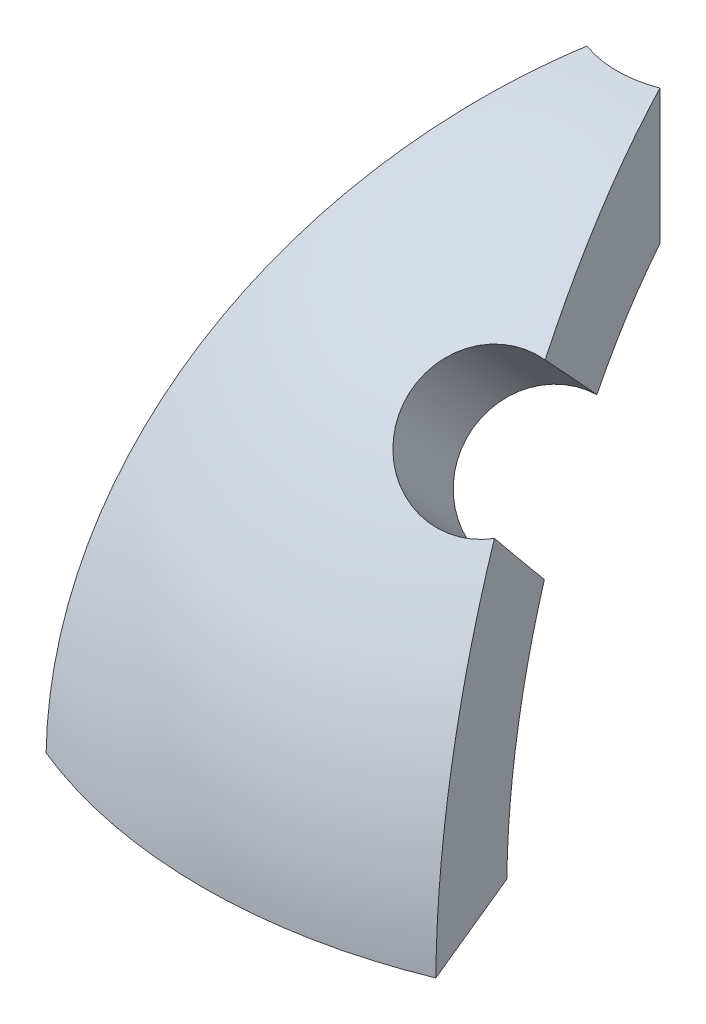
ISO-10303-21;
HEADER;
FILE_DESCRIPTION(('STEP AP214'),'2;1');
FILE_NAME('part.step','',(''),(''),'','','');
FILE_SCHEMA(('AUTOMOTIVE_DESIGN { 1 0 10303 214 1 1 1 1 }'));
ENDSEC;
DATA;
#1=APPLICATION_CONTEXT('core data for automotive mechanical design processes');
#2=APPLICATION_PROTOCOL_DEFINITION('international standard','automotive_design',2000,#1);
#3=PRODUCT_CONTEXT('',#1,'mechanical');
#4=PRODUCT('Part','Part','',(#3));
#5=PRODUCT_RELATED_PRODUCT_CATEGORY('part','',(#4));
#6=PRODUCT_DEFINITION_FORMATION('','',#4);
#7=PRODUCT_DEFINITION_CONTEXT('part definition',#1,'design');
#8=PRODUCT_DEFINITION('design','',#6,#7);
#9=PRODUCT_DEFINITION_SHAPE('','',#8);
#10=(LENGTH_UNIT() NAMED_UNIT(*) SI_UNIT(.MILLI.,.METRE.));
#11=(NAMED_UNIT(*) PLANE_ANGLE_UNIT() SI_UNIT($,.RADIAN.));
#12=(NAMED_UNIT(*) SI_UNIT($,.STERADIAN.) SOLID_ANGLE_UNIT());
#13=UNCERTAINTY_MEASURE_WITH_UNIT(LENGTH_MEASURE(1.E-05),#10,'distance_accuracy_value','');
#14=(GEOMETRIC_REPRESENTATION_CONTEXT(3) GLOBAL_UNCERTAINTY_ASSIGNED_CONTEXT((#13)) GLOBAL_UNIT_ASSIGNED_CONTEXT((#10,
#11,#12)) REPRESENTATION_CONTEXT('',''));
#15=CARTESIAN_POINT('',(0.,0.,0.));
#16=DIRECTION('',(0.,0.,1.));
#17=DIRECTION('',(1.,0.,0.));
#18=AXIS2_PLACEMENT_3D('',#15,#16,#17);
#19=CARTESIAN_POINT('',(7.17384970083417,0.249999999999994,17.6458459833991));
#20=DIRECTION('',(0.923879532511287,0.,-0.382683432365091));
#21=DIRECTION('',(-0.38268343236509,0.,-0.923879532511286));
#22=AXIS2_PLACEMENT_3D('',#19,#20,#21);
#23=PLANE('',#22);
#24=CARTESIAN_POINT('',(0.492321813532581,1.59318685539747,1.51521074050156));
#25=DIRECTION('',(0.923879532511287,0.,-0.382683432365091));
#26=DIRECTION('',(-0.270180002552571,-0.708197506935701,-0.652272226444412));
#27=AXIS2_PLACEMENT_3D('',#24,#25,#26);
#28=ELLIPSE('',#27,46.9277013134247,2.6035);
#29=CARTESIAN_POINT('',(2.98234832718969,11.6903075043123,7.52666652044114));
#30=VERTEX_POINT('',#29);
#31=CARTESIAN_POINT('',(4.32941926490117,15.0988892378005,10.7787834477428));
#32=VERTEX_POINT('',#31);
#33=EDGE_CURVE('E11',#30,#32,#28,.T.);
#34=ORIENTED_EDGE('',*,*,#33,.F.);
#35=CARTESIAN_POINT('',(-0.115484941563909,0.,0.0478354290456357));
#36=DIRECTION('',(0.923879532511287,0.,-0.382683432365091));
#37=DIRECTION('',(-0.38268343236509,0.,-0.923879532511286));
#38=AXIS2_PLACEMENT_3D('',#35,#36,#37);
#39=CIRCLE('',#38,14.2194505871359);
#40=CARTESIAN_POINT('',(1.34175402255179,13.7000839413487,3.56592149983228));
#41=VERTEX_POINT('',#40);
#42=EDGE_CURVE('E133',#30,#41,#39,.F.);
#43=ORIENTED_EDGE('',*,*,#42,.T.);
#44=DIRECTION('',(0.,-1.,0.));
#45=VECTOR('',#44,1.);
#46=CARTESIAN_POINT('',(1.34175402255179,0.249999999999994,3.56592149983228));
#47=LINE('',#46,#45);
#48=CARTESIAN_POINT('',(1.34175402255179,18.6651118400078,3.56592149983228));
#49=VERTEX_POINT('',#48);
#50=EDGE_CURVE('E306',#49,#41,#47,.T.);
#51=ORIENTED_EDGE('',*,*,#50,.F.);
#52=CARTESIAN_POINT('',(-0.115484941563909,0.,0.0478354290456357));
#53=DIRECTION('',(0.923879532511287,0.,-0.382683432365091));
#54=DIRECTION('',(-0.38268343236509,0.,-0.923879532511286));
#55=AXIS2_PLACEMENT_3D('',#52,#53,#54);
#56=CIRCLE('',#55,19.0495898905987);
#57=EDGE_CURVE('E142',#49,#32,#56,.T.);
#58=ORIENTED_EDGE('',*,*,#57,.T.);
#59=EDGE_LOOP('',(#34,#43,#51,#58));
#60=FACE_BOUND('',#59,.T.);
#61=ADVANCED_FACE('F32',(#60),#23,.T.);
#62=CARTESIAN_POINT('',(0.,0.,0.));
#63=DIRECTION('',(0.,-1.,0.));
#64=DIRECTION('',(0.382683432365091,0.,0.923879532511287));
#65=AXIS2_PLACEMENT_3D('',#62,#63,#64);
#66=SPHERICAL_SURFACE('',#65,14.22);
#67=CARTESIAN_POINT('',(-1.48166666666665,5.87529327607244,12.8644468520425));
#68=CARTESIAN_POINT('',(-1.42086893273893,5.76975036627852,12.9196521368901));
#69=CARTESIAN_POINT('',(-1.36001346299936,5.66335616706572,12.9731664611157));
#70=CARTESIAN_POINT('',(-1.23637473856811,5.44571138508336,13.0783402627304));
#71=CARTESIAN_POINT('',(-1.17358894317086,5.33441133368615,13.129894406193));
#72=CARTESIAN_POINT('',(-1.04611725994298,5.10690837230407,13.2307839552985));
#73=CARTESIAN_POINT('',(-0.981429827464168,4.99065756610066,13.2800094265762));
#74=CARTESIAN_POINT('',(-0.850206043293077,4.75321700490823,13.3758648751859));
#75=CARTESIAN_POINT('',(-0.783669691408958,4.63198105417047,13.4223804529465));
#76=CARTESIAN_POINT('',(-0.648818878876879,4.38454861638548,13.5124257578623));
#77=CARTESIAN_POINT('',(-0.580506340326631,4.25830785909068,13.5558367279241));
#78=CARTESIAN_POINT('',(-0.44220033088774,4.00085602750009,13.6392712749654));
#79=CARTESIAN_POINT('',(-0.372211218313539,3.86960273238015,13.6791719067114));
#80=CARTESIAN_POINT('',(-0.239264709370852,3.61840253676486,13.7505509697998));
#81=CARTESIAN_POINT('',(-0.176283542174099,3.49859339830511,13.7824709063809));
#82=CARTESIAN_POINT('',(-0.0483877174452765,3.25370801386755,13.8434149901452));
#83=CARTESIAN_POINT('',(0.0165184869663606,3.12859289852388,13.8723008279838));
#84=CARTESIAN_POINT('',(0.148172985815007,2.87309896609117,13.9267314310082));
#85=CARTESIAN_POINT('',(0.21491041802518,2.74268389154307,13.9521324200803));
#86=CARTESIAN_POINT('',(0.343164735365423,2.49027877052822,13.9967203057924));
#87=CARTESIAN_POINT('',(0.404711039503561,2.36835935764257,14.0162232249644));
#88=CARTESIAN_POINT('',(0.530033371249447,2.1185076517405,14.0520491156242));
#89=CARTESIAN_POINT('',(0.593791791052467,1.99054177695114,14.0681997859072));
#90=CARTESIAN_POINT('',(0.723418550548894,1.7286220788303,14.0967857912238));
#91=CARTESIAN_POINT('',(0.78926595677875,1.59463823943027,14.1090412249634));
#92=CARTESIAN_POINT('',(0.854807692307689,1.46033282107786,14.1189635547676));
#93=B_SPLINE_CURVE_WITH_KNOTS('',3,(#67,#68,#69,#70,#71,#72,#73,#74,#75,#76,#77,#78,#79,#80,#81,
#82,#83,#84,#85,#86,#87,#88,#89,#90,#91,#92),.UNSPECIFIED.,.F.,.F.,(4,2,2,2,2,2,2,2,2,2,2,2,4),
(0.,0.401172200971263,0.814500006306101,1.23999083596385,1.67764315177395,2.12744659449352,
2.58938209434428,3.00652551609497,3.43809407127766,3.88407377372127,4.29789288094576,
4.72946381163026,5.17876538736432),.UNSPECIFIED.);
#94=CARTESIAN_POINT('',(-1.48166666666665,5.87529327607244,12.8644468520425));
#95=VERTEX_POINT('',#94);
#96=CARTESIAN_POINT('',(0.85480769230769,1.46033282107786,14.1189635547676));
#97=VERTEX_POINT('',#96);
#98=EDGE_CURVE('E270',#95,#97,#93,.T.);
#99=ORIENTED_EDGE('',*,*,#98,.T.);
#100=CARTESIAN_POINT('',(1.9112146306949,-3.20816110225398,1.32886383883141));
#101=DIRECTION('',(-0.482179429384514,0.809385437310081,-0.335258425321114));
#102=DIRECTION('',(-0.859105109331939,-0.51179919022968,0.));
#103=AXIS2_PLACEMENT_3D('',#100,#101,#102);
#104=CIRCLE('',#103,13.6564080883389);
#105=CARTESIAN_POINT('',(1.19940204326923,1.64671129814356,14.0733143445021));
#106=VERTEX_POINT('',#105);
#107=EDGE_CURVE('E356',#97,#106,#104,.T.);
#108=ORIENTED_EDGE('',*,*,#107,.T.);
#109=CARTESIAN_POINT('',(1.19940204326923,1.64671129814356,14.0733143445021));
#110=CARTESIAN_POINT('',(1.11175897370505,1.8261469432776,14.0597906494216));
#111=CARTESIAN_POINT('',(1.02355742639663,2.00499486247325,14.0421082758238));
#112=CARTESIAN_POINT('',(0.850557226871007,2.35253189006911,13.9995277661819));
#113=CARTESIAN_POINT('',(0.76580235225976,2.5212911240452,13.9750235116964));
#114=CARTESIAN_POINT('',(0.599997395950827,2.84859571868195,13.9200047447954));
#115=CARTESIAN_POINT('',(0.518980497130618,3.0072206583889,13.8898633708842));
#116=CARTESIAN_POINT('',(0.360843119207751,3.31425197043435,13.8247282691326));
#117=CARTESIAN_POINT('',(0.283749144195016,3.46274664640733,13.7900855703636));
#118=CARTESIAN_POINT('',(0.117544091040401,3.78021370926336,13.7092371026251));
#119=CARTESIAN_POINT('',(0.0283681722304077,3.94890988583186,13.6620760095911));
#120=CARTESIAN_POINT('',(-0.146955945360959,4.27751987634609,13.5619105455538));
#121=CARTESIAN_POINT('',(-0.2330928587166,4.43752640982812,13.5091901301889));
#122=CARTESIAN_POINT('',(-0.402153293341576,4.74878568628147,13.3988344477555));
#123=CARTESIAN_POINT('',(-0.485071707423076,4.90013707693129,13.3414695369824));
#124=CARTESIAN_POINT('',(-0.647580491103558,5.19415209678653,13.2227183467426));
#125=CARTESIAN_POINT('',(-0.727169981873179,5.33691968637669,13.1615881482638));
#126=CARTESIAN_POINT('',(-0.806724759615385,5.47837505910695,13.0975189205429));
#127=B_SPLINE_CURVE_WITH_KNOTS('',3,(#109,#110,#111,#112,#113,#114,#115,#116,#117,#118,#119,
#120,#121,#122,#123,#124,#125,#126),.UNSPECIFIED.,.F.,.F.,(4,2,2,2,2,2,2,2,4),(0.,
0.60041199494205,1.17154786919235,1.71336272245475,2.22584545162551,2.81534377356477,
3.38282946794536,3.9282782817861,4.45169165792834),.UNSPECIFIED.);
#128=CARTESIAN_POINT('',(-0.806724759615385,5.47837505910695,13.0975189205429));
#129=VERTEX_POINT('',#128);
#130=EDGE_CURVE('E162',#106,#129,#127,.T.);
#131=ORIENTED_EDGE('',*,*,#130,.T.);
#132=CARTESIAN_POINT('',(0.,0.0454133839248742,-0.0188108395349421));
#133=DIRECTION('',(0.,0.923879532511287,-0.38268343236509));
#134=DIRECTION('',(0.,0.38268343236509,0.923879532511287));
#135=AXIS2_PLACEMENT_3D('',#132,#133,#134);
#136=CIRCLE('',#135,14.2199150411272);
#137=CARTESIAN_POINT('',(1.25371794871795,5.46594792139122,13.0675171561281));
#138=VERTEX_POINT('',#137);
#139=EDGE_CURVE('E335',#129,#138,#136,.T.);
#140=ORIENTED_EDGE('',*,*,#139,.T.);
#141=CARTESIAN_POINT('',(1.25371794871795,0.,0.));
#142=DIRECTION('',(-1.,0.,0.));
#143=DIRECTION('',(0.,0.,1.));
#144=AXIS2_PLACEMENT_3D('',#141,#142,#143);
#145=CIRCLE('',#144,14.1646246439877);
#146=CARTESIAN_POINT('',(1.25371794871795,5.88372807310244,12.8848102534282));
#147=VERTEX_POINT('',#146);
#148=EDGE_CURVE('E246',#138,#147,#145,.T.);
#149=ORIENTED_EDGE('',*,*,#148,.T.);
#150=CARTESIAN_POINT('',(0.,0.46660769387489,-0.193275235110616));
#151=DIRECTION('',(0.,-0.923879532511287,0.38268343236509));
#152=DIRECTION('',(0.,-0.38268343236509,-0.923879532511287));
#153=AXIS2_PLACEMENT_3D('',#150,#151,#152);
#154=CIRCLE('',#153,14.2110281803784);
#155=EDGE_CURVE('E256',#147,#95,#154,.T.);
#156=ORIENTED_EDGE('',*,*,#155,.T.);
#157=EDGE_LOOP('',(#99,#108,#131,#140,#149,#156));
#158=FACE_BOUND('',#157,.T.);
#159=ORIENTED_EDGE('',*,*,#42,.F.);
#160=CARTESIAN_POINT('',(3.05466220089719,9.88509453040283,9.40128356733324));
#161=DIRECTION('',(-0.218508012224402,-0.707106781186547,-0.67249851196396));
#162=DIRECTION('',(0.,0.689151757774653,-0.724617040067445));
#163=AXIS2_PLACEMENT_3D('',#160,#161,#162);
#164=CIRCLE('',#163,2.6035);
#165=CARTESIAN_POINT('',(4.34861643247468,8.13108272087329,10.8251295100579));
#166=VERTEX_POINT('',#165);
#167=EDGE_CURVE('E119',#30,#166,#164,.F.);
#168=ORIENTED_EDGE('',*,*,#167,.T.);
#169=CARTESIAN_POINT('',(5.32522212941495,0.249999999999996,13.182864228702));
#170=VERTEX_POINT('',#169);
#171=EDGE_CURVE('E130',#170,#166,#39,.F.);
#172=ORIENTED_EDGE('',*,*,#171,.F.);
#173=CARTESIAN_POINT('',(0.,0.249999999999996,0.));
#174=DIRECTION('',(0.,-1.,0.));
#175=DIRECTION('',(0.,0.,-1.));
#176=AXIS2_PLACEMENT_3D('',#173,#174,#175);
#177=CIRCLE('',#176,14.2178022211592);
#178=CARTESIAN_POINT('',(-5.32522212941495,0.249999999999996,13.182864228702));
#179=VERTEX_POINT('',#178);
#180=EDGE_CURVE('E138',#170,#179,#177,.T.);
#181=ORIENTED_EDGE('',*,*,#180,.T.);
#182=CARTESIAN_POINT('',(0.115484941563912,0.,0.0478354290456367));
#183=DIRECTION('',(-0.923879532511286,0.,-0.382683432365091));
#184=DIRECTION('',(-0.382683432365091,0.,0.923879532511286));
#185=AXIS2_PLACEMENT_3D('',#182,#183,#184);
#186=CIRCLE('',#185,14.2194505871359);
#187=CARTESIAN_POINT('',(-1.34175402255179,13.7000839413487,3.56592149983228));
#188=VERTEX_POINT('',#187);
#189=EDGE_CURVE('E367',#188,#179,#186,.F.);
#190=ORIENTED_EDGE('',*,*,#189,.F.);
#191=CARTESIAN_POINT('',(0.,13.7000839413487,0.));
#192=DIRECTION('',(0.,-1.,0.));
#193=DIRECTION('',(0.,0.,-1.));
#194=AXIS2_PLACEMENT_3D('',#191,#192,#193);
#195=CIRCLE('',#194,3.81);
#196=EDGE_CURVE('E151',#41,#188,#195,.T.);
#197=ORIENTED_EDGE('',*,*,#196,.F.);
#198=EDGE_LOOP('',(#159,#168,#172,#181,#190,#197));
#199=FACE_BOUND('',#198,.T.);
#200=ADVANCED_FACE('F128',(#158,#199),#66,.F.);
#201=CARTESIAN_POINT('',(0.,0.,0.));
#202=DIRECTION('',(0.,-1.,0.));
#203=DIRECTION('',(0.,0.,-1.));
#204=AXIS2_PLACEMENT_3D('',#201,#202,#203);
#205=CYLINDRICAL_SURFACE('',#204,3.81);
#206=ORIENTED_EDGE('',*,*,#50,.T.);
#207=ORIENTED_EDGE('',*,*,#196,.T.);
#208=DIRECTION('',(0.,-1.,0.));
#209=VECTOR('',#208,1.);
#210=CARTESIAN_POINT('',(-1.34175402255179,0.249999999999994,3.56592149983228));
#211=LINE('',#210,#209);
#212=CARTESIAN_POINT('',(-1.34175402255179,18.6651118400078,3.56592149983228));
#213=VERTEX_POINT('',#212);
#214=EDGE_CURVE('E354',#213,#188,#211,.T.);
#215=ORIENTED_EDGE('',*,*,#214,.F.);
#216=CARTESIAN_POINT('',(0.,18.6651118400078,0.));
#217=DIRECTION('',(0.,-1.,0.));
#218=DIRECTION('',(0.,0.,-1.));
#219=AXIS2_PLACEMENT_3D('',#216,#217,#218);
#220=CIRCLE('',#219,3.81);
#221=EDGE_CURVE('E148',#49,#213,#220,.T.);
#222=ORIENTED_EDGE('',*,*,#221,.F.);
#223=EDGE_LOOP('',(#206,#207,#215,#222));
#224=FACE_BOUND('',#223,.T.);
#225=ADVANCED_FACE('F34',(#224),#205,.F.);
#226=CARTESIAN_POINT('',(0.,0.,0.));
#227=DIRECTION('',(0.,-1.,0.));
#228=DIRECTION('',(0.382683432365091,0.,0.923879532511287));
#229=AXIS2_PLACEMENT_3D('',#226,#227,#228);
#230=SPHERICAL_SURFACE('',#229,19.05);
#231=CARTESIAN_POINT('',(5.64885900222212,11.6616556559279,13.964192756317));
#232=VERTEX_POINT('',#231);
#233=CARTESIAN_POINT('',(7.17384970083417,0.249999999999994,17.6458459833991));
#234=VERTEX_POINT('',#233);
#235=EDGE_CURVE('E365',#232,#234,#56,.T.);
#236=ORIENTED_EDGE('',*,*,#235,.F.);
#237=CARTESIAN_POINT('',(4.12352054834733,13.3439928010697,12.690891306853));
#238=DIRECTION('',(-0.218508012224402,-0.707106781186548,-0.67249851196396));
#239=DIRECTION('',(0.,0.689151757774653,-0.724617040067445));
#240=AXIS2_PLACEMENT_3D('',#237,#238,#239);
#241=CIRCLE('',#240,2.6035);
#242=EDGE_CURVE('E46',#232,#32,#241,.T.);
#243=ORIENTED_EDGE('',*,*,#242,.T.);
#244=ORIENTED_EDGE('',*,*,#57,.F.);
#245=ORIENTED_EDGE('',*,*,#221,.T.);
#246=CARTESIAN_POINT('',(0.115484941563912,0.,0.0478354290456367));
#247=DIRECTION('',(-0.923879532511286,0.,-0.382683432365091));
#248=DIRECTION('',(-0.382683432365091,0.,0.923879532511286));
#249=AXIS2_PLACEMENT_3D('',#246,#247,#248);
#250=CIRCLE('',#249,19.0495898905987);
#251=CARTESIAN_POINT('',(-7.17384970083417,0.249999999999995,17.6458459833991));
#252=VERTEX_POINT('',#251);
#253=EDGE_CURVE('E368',#252,#213,#250,.T.);
#254=ORIENTED_EDGE('',*,*,#253,.F.);
#255=CARTESIAN_POINT('',(0.,0.249999999999994,0.));
#256=DIRECTION('',(0.,-1.,0.));
#257=DIRECTION('',(0.,0.,-1.));
#258=AXIS2_PLACEMENT_3D('',#255,#256,#257);
#259=CIRCLE('',#258,19.0483595094171);
#260=EDGE_CURVE('E140',#234,#252,#259,.T.);
#261=ORIENTED_EDGE('',*,*,#260,.F.);
#262=EDGE_LOOP('',(#236,#243,#244,#245,#254,#261));
#263=FACE_BOUND('',#262,.T.);
#264=ADVANCED_FACE('F189',(#263),#230,.T.);
#265=CARTESIAN_POINT('',(5.44091735468122,0.249999999999995,13.1355364694225));
#266=DIRECTION('',(0.,1.,0.));
#267=DIRECTION('',(0.,0.,1.));
#268=AXIS2_PLACEMENT_3D('',#265,#266,#267);
#269=PLANE('',#268);
#270=DIRECTION('',(-0.38268343236509,0.,-0.923879532511286));
#271=VECTOR('',#270,1.);
#272=CARTESIAN_POINT('',(5.32543241311731,0.249999999999995,13.1833718984682));
#273=LINE('',#272,#271);
#274=EDGE_CURVE('E124',#234,#170,#273,.T.);
#275=ORIENTED_EDGE('',*,*,#274,.F.);
#276=ORIENTED_EDGE('',*,*,#260,.T.);
#277=DIRECTION('',(-0.382683432365091,0.,0.923879532511286));
#278=VECTOR('',#277,1.);
#279=CARTESIAN_POINT('',(-3.73182461580675,0.249999999999995,9.33606234109748));
#280=LINE('',#279,#278);
#281=EDGE_CURVE('E154',#179,#252,#280,.T.);
#282=ORIENTED_EDGE('',*,*,#281,.F.);
#283=ORIENTED_EDGE('',*,*,#180,.F.);
#284=EDGE_LOOP('',(#275,#276,#282,#283));
#285=FACE_BOUND('',#284,.T.);
#286=ADVANCED_FACE('F179',(#285),#269,.F.);
#287=CARTESIAN_POINT('',(-7.17384970083417,0.249999999999994,17.6458459833991));
#288=DIRECTION('',(-0.923879532511286,0.,-0.382683432365091));
#289=DIRECTION('',(-0.382683432365091,0.,0.923879532511286));
#290=AXIS2_PLACEMENT_3D('',#287,#288,#289);
#291=PLANE('',#290);
#292=ORIENTED_EDGE('',*,*,#189,.T.);
#293=ORIENTED_EDGE('',*,*,#281,.T.);
#294=ORIENTED_EDGE('',*,*,#253,.T.);
#295=ORIENTED_EDGE('',*,*,#214,.T.);
#296=EDGE_LOOP('',(#292,#293,#294,#295));
#297=FACE_BOUND('',#296,.T.);
#298=ADVANCED_FACE('F177',(#297),#291,.T.);
#299=EDGE_CURVE('E36',#232,#166,#28,.T.);
#300=ORIENTED_EDGE('',*,*,#299,.F.);
#301=ORIENTED_EDGE('',*,*,#235,.T.);
#302=ORIENTED_EDGE('',*,*,#274,.T.);
#303=ORIENTED_EDGE('',*,*,#171,.T.);
#304=EDGE_LOOP('',(#300,#301,#302,#303));
#305=FACE_BOUND('',#304,.T.);
#306=ADVANCED_FACE('F136',(#305),#23,.T.);
#307=CARTESIAN_POINT('',(0.,0.145802387731092,0.3519981018868));
#308=DIRECTION('',(0.,-1.,0.));
#309=DIRECTION('',(0.382683432365091,0.,0.923879532511287));
#310=AXIS2_PLACEMENT_3D('',#307,#308,#309);
#311=SPHERICAL_SURFACE('',#310,14.22);
#312=CARTESIAN_POINT('',(1.19940204326923,1.79251368587466,14.4253124463889));
#313=CARTESIAN_POINT('',(0.710957566465923,2.79261443892135,14.3499189832821));
#314=CARTESIAN_POINT('',(0.206454512715779,3.75618894739321,14.1044846197493));
#315=CARTESIAN_POINT('',(-0.298295863373699,4.7202358286283,13.8589299370223));
#316=CARTESIAN_POINT('',(-0.806724759615384,5.62417744683805,13.4495170224297));
#317=B_SPLINE_CURVE_WITH_KNOTS('',2,(#312,#313,#314,#315,#316),.UNSPECIFIED.,.F.,.F.,(3,2,3),
(0.,0.5,1.),.UNSPECIFIED.);
#318=CARTESIAN_POINT('',(1.19940204326923,1.79251368587466,14.4253124463889));
#319=VERTEX_POINT('',#318);
#320=CARTESIAN_POINT('',(-0.806724759615387,5.62417744683805,13.4495170224297));
#321=VERTEX_POINT('',#320);
#322=EDGE_CURVE('E332',#319,#321,#317,.T.);
#323=ORIENTED_EDGE('',*,*,#322,.F.);
#324=CARTESIAN_POINT('',(1.9112146306949,-3.06235871452288,1.68086194071821));
#325=DIRECTION('',(-0.482179429384514,0.809385437310081,-0.335258425321114));
#326=DIRECTION('',(-0.859105109331939,-0.51179919022968,0.));
#327=AXIS2_PLACEMENT_3D('',#324,#325,#326);
#328=CIRCLE('',#327,13.6564080883389);
#329=CARTESIAN_POINT('',(0.85480769230769,1.60613520880896,14.4709616566544));
#330=VERTEX_POINT('',#329);
#331=EDGE_CURVE('E134',#330,#319,#328,.T.);
#332=ORIENTED_EDGE('',*,*,#331,.F.);
#333=CARTESIAN_POINT('',(-1.48166666666665,6.02109566380354,13.2164449539293));
#334=CARTESIAN_POINT('',(-0.891241682341102,4.99618215915835,13.7525333314677));
#335=CARTESIAN_POINT('',(-0.30235092414339,3.88340526768302,14.0686780438569));
#336=CARTESIAN_POINT('',(0.286787256279922,2.77016084342465,14.3849555843254));
#337=CARTESIAN_POINT('',(0.85480769230769,1.60613520880896,14.4709616566544));
#338=B_SPLINE_CURVE_WITH_KNOTS('',2,(#333,#334,#335,#336,#337),.UNSPECIFIED.,.F.,.F.,(3,2,3),
(0.,0.5,1.),.UNSPECIFIED.);
#339=CARTESIAN_POINT('',(-1.48166666666665,6.02109566380354,13.2164449539293));
#340=VERTEX_POINT('',#339);
#341=EDGE_CURVE('E276',#340,#330,#338,.T.);
#342=ORIENTED_EDGE('',*,*,#341,.F.);
#343=CARTESIAN_POINT('',(0.,0.61241008160599,0.158722866776184));
#344=DIRECTION('',(0.,-0.923879532511287,0.38268343236509));
#345=DIRECTION('',(0.,-0.38268343236509,-0.923879532511287));
#346=AXIS2_PLACEMENT_3D('',#343,#344,#345);
#347=CIRCLE('',#346,14.2110281803784);
#348=CARTESIAN_POINT('',(1.25371794871795,6.02953046083354,13.236808355315));
#349=VERTEX_POINT('',#348);
#350=EDGE_CURVE('E262',#349,#340,#347,.T.);
#351=ORIENTED_EDGE('',*,*,#350,.F.);
#352=CARTESIAN_POINT('',(1.25371794871795,0.145802387731092,0.3519981018868));
#353=DIRECTION('',(-1.,0.,0.));
#354=DIRECTION('',(0.,0.,1.));
#355=AXIS2_PLACEMENT_3D('',#352,#353,#354);
#356=CIRCLE('',#355,14.1646246439877);
#357=CARTESIAN_POINT('',(1.25371794871795,5.61175030912232,13.4195152580149));
#358=VERTEX_POINT('',#357);
#359=EDGE_CURVE('E247',#358,#349,#356,.T.);
#360=ORIENTED_EDGE('',*,*,#359,.F.);
#361=CARTESIAN_POINT('',(0.,0.191215771655973,0.333187262351858));
#362=DIRECTION('',(0.,0.923879532511287,-0.38268343236509));
#363=DIRECTION('',(0.,0.38268343236509,0.923879532511287));
#364=AXIS2_PLACEMENT_3D('',#361,#362,#363);
#365=CIRCLE('',#364,14.2199150411272);
#366=EDGE_CURVE('E252',#321,#358,#365,.T.);
#367=ORIENTED_EDGE('',*,*,#366,.F.);
#368=EDGE_LOOP('',(#323,#332,#342,#351,#360,#367));
#369=FACE_BOUND('',#368,.T.);
#370=ADVANCED_FACE('F203',(#369),#311,.F.);
#371=CARTESIAN_POINT('',(1.19940204326923,1.64671129814356,14.0733143445021));
#372=DIRECTION('',(0.482179429384509,-0.809385437310084,0.335258425321115));
#373=DIRECTION('',(0.859105109331943,0.511799190229675,0.));
#374=AXIS2_PLACEMENT_3D('',#371,#372,#373);
#375=PLANE('',#374);
#376=ORIENTED_EDGE('',*,*,#331,.T.);
#377=DIRECTION('',(0.,0.38268343236509,0.923879532511287));
#378=VECTOR('',#377,1.);
#379=CARTESIAN_POINT('',(1.19940204326923,1.64671129814356,14.0733143445021));
#380=LINE('',#379,#378);
#381=EDGE_CURVE('E353',#106,#319,#380,.T.);
#382=ORIENTED_EDGE('',*,*,#381,.F.);
#383=ORIENTED_EDGE('',*,*,#107,.F.);
#384=DIRECTION('',(0.,0.38268343236509,0.923879532511287));
#385=VECTOR('',#384,1.);
#386=CARTESIAN_POINT('',(0.85480769230769,1.46033282107786,14.1189635547676));
#387=LINE('',#386,#385);
#388=EDGE_CURVE('E282',#97,#330,#387,.T.);
#389=ORIENTED_EDGE('',*,*,#388,.T.);
#390=EDGE_LOOP('',(#376,#382,#383,#389));
#391=FACE_BOUND('',#390,.T.);
#392=ADVANCED_FACE('F209',(#391),#375,.F.);
#393=CARTESIAN_POINT('',(0.85480769230769,1.46033282107786,14.1189635547676));
#394=DIRECTION('',(-0.889933250556877,-0.421372946689,0.174538389335699));
#395=DIRECTION('',(0.427941693452205,-0.903806343751392,0.));
#396=AXIS2_PLACEMENT_3D('',#393,#394,#395);
#397=PLANE('',#396);
#398=ORIENTED_EDGE('',*,*,#341,.T.);
#399=ORIENTED_EDGE('',*,*,#388,.F.);
#400=ORIENTED_EDGE('',*,*,#98,.F.);
#401=DIRECTION('',(0.,0.38268343236509,0.923879532511287));
#402=VECTOR('',#401,1.);
#403=CARTESIAN_POINT('',(-1.48166666666665,5.87529327607244,12.8644468520425));
#404=LINE('',#403,#402);
#405=EDGE_CURVE('E273',#95,#340,#404,.T.);
#406=ORIENTED_EDGE('',*,*,#405,.T.);
#407=EDGE_LOOP('',(#398,#399,#400,#406));
#408=FACE_BOUND('',#407,.T.);
#409=ADVANCED_FACE('F308',(#408),#397,.F.);
#410=CARTESIAN_POINT('',(-1.48166666666665,5.87529327607244,12.8644468520425));
#411=DIRECTION('',(0.,0.923879532511287,-0.38268343236509));
#412=DIRECTION('',(0.,0.38268343236509,0.923879532511287));
#413=AXIS2_PLACEMENT_3D('',#410,#411,#412);
#414=PLANE('',#413);
#415=ORIENTED_EDGE('',*,*,#350,.T.);
#416=ORIENTED_EDGE('',*,*,#405,.F.);
#417=ORIENTED_EDGE('',*,*,#155,.F.);
#418=DIRECTION('',(0.,0.38268343236509,0.923879532511287));
#419=VECTOR('',#418,1.);
#420=CARTESIAN_POINT('',(1.25371794871795,5.88372807310244,12.8848102534282));
#421=LINE('',#420,#419);
#422=EDGE_CURVE('E259',#147,#349,#421,.T.);
#423=ORIENTED_EDGE('',*,*,#422,.T.);
#424=EDGE_LOOP('',(#415,#416,#417,#423));
#425=FACE_BOUND('',#424,.T.);
#426=ADVANCED_FACE('F318',(#425),#414,.F.);
#427=CARTESIAN_POINT('',(1.25371794871795,5.88372807310244,12.8848102534282));
#428=DIRECTION('',(1.,0.,0.));
#429=DIRECTION('',(0.,1.,0.));
#430=AXIS2_PLACEMENT_3D('',#427,#428,#429);
#431=PLANE('',#430);
#432=ORIENTED_EDGE('',*,*,#359,.T.);
#433=ORIENTED_EDGE('',*,*,#422,.F.);
#434=ORIENTED_EDGE('',*,*,#148,.F.);
#435=DIRECTION('',(0.,0.38268343236509,0.923879532511287));
#436=VECTOR('',#435,1.);
#437=CARTESIAN_POINT('',(1.25371794871794,5.46594792139122,13.0675171561281));
#438=LINE('',#437,#436);
#439=EDGE_CURVE('E238',#138,#358,#438,.T.);
#440=ORIENTED_EDGE('',*,*,#439,.T.);
#441=EDGE_LOOP('',(#432,#433,#434,#440));
#442=FACE_BOUND('',#441,.T.);
#443=ADVANCED_FACE('F220',(#442),#431,.F.);
#444=CARTESIAN_POINT('',(1.25371794871794,5.46594792139122,13.0675171561281));
#445=DIRECTION('',(0.,-0.923879532511287,0.38268343236509));
#446=DIRECTION('',(0.,-0.38268343236509,-0.923879532511287));
#447=AXIS2_PLACEMENT_3D('',#444,#445,#446);
#448=PLANE('',#447);
#449=ORIENTED_EDGE('',*,*,#366,.T.);
#450=ORIENTED_EDGE('',*,*,#439,.F.);
#451=ORIENTED_EDGE('',*,*,#139,.F.);
#452=DIRECTION('',(0.,0.38268343236509,0.923879532511287));
#453=VECTOR('',#452,1.);
#454=CARTESIAN_POINT('',(-0.806724759615385,5.47837505910695,13.0975189205429));
#455=LINE('',#454,#453);
#456=EDGE_CURVE('E54',#129,#321,#455,.T.);
#457=ORIENTED_EDGE('',*,*,#456,.T.);
#458=EDGE_LOOP('',(#449,#450,#451,#457));
#459=FACE_BOUND('',#458,.T.);
#460=ADVANCED_FACE('F213',(#459),#448,.F.);
#461=CARTESIAN_POINT('',(-0.806724759615385,5.47837505910695,13.0975189205429));
#462=DIRECTION('',(0.889887017756643,0.421456279772427,-0.174572907029049));
#463=DIRECTION('',(-0.428028985635298,0.903765006766702,0.));
#464=AXIS2_PLACEMENT_3D('',#461,#462,#463);
#465=PLANE('',#464);
#466=ORIENTED_EDGE('',*,*,#322,.T.);
#467=ORIENTED_EDGE('',*,*,#456,.F.);
#468=ORIENTED_EDGE('',*,*,#130,.F.);
#469=ORIENTED_EDGE('',*,*,#381,.T.);
#470=EDGE_LOOP('',(#466,#467,#468,#469));
#471=FACE_BOUND('',#470,.T.);
#472=ADVANCED_FACE('F204',(#471),#465,.F.);
#473=CARTESIAN_POINT('',(6.02552542467752,19.4990098744105,18.5446604023618));
#474=DIRECTION('',(-0.218508012224402,-0.707106781186548,-0.67249851196396));
#475=DIRECTION('',(0.,0.689151757774653,-0.724617040067445));
#476=AXIS2_PLACEMENT_3D('',#473,#474,#475);
#477=CYLINDRICAL_SURFACE('',#476,2.6035);
#478=ORIENTED_EDGE('',*,*,#33,.T.);
#479=ORIENTED_EDGE('',*,*,#242,.F.);
#480=ORIENTED_EDGE('',*,*,#299,.T.);
#481=ORIENTED_EDGE('',*,*,#167,.F.);
#482=EDGE_LOOP('',(#478,#479,#480,#481));
#483=FACE_BOUND('',#482,.T.);
#484=ADVANCED_FACE('F118',(#483),#477,.F.);
#485=CLOSED_SHELL('',(#61,#200,#225,#264,#286,#298,#306,#370,#392,#409,#426,#443,#460,#472,#484));
#486=MANIFOLD_SOLID_BREP('B2',#485);
#487=ADVANCED_BREP_SHAPE_REPRESENTATION('',(#18,#486),#14);
#488=SHAPE_DEFINITION_REPRESENTATION(#9,#487);
ENDSEC;
END-ISO-10303-21;
